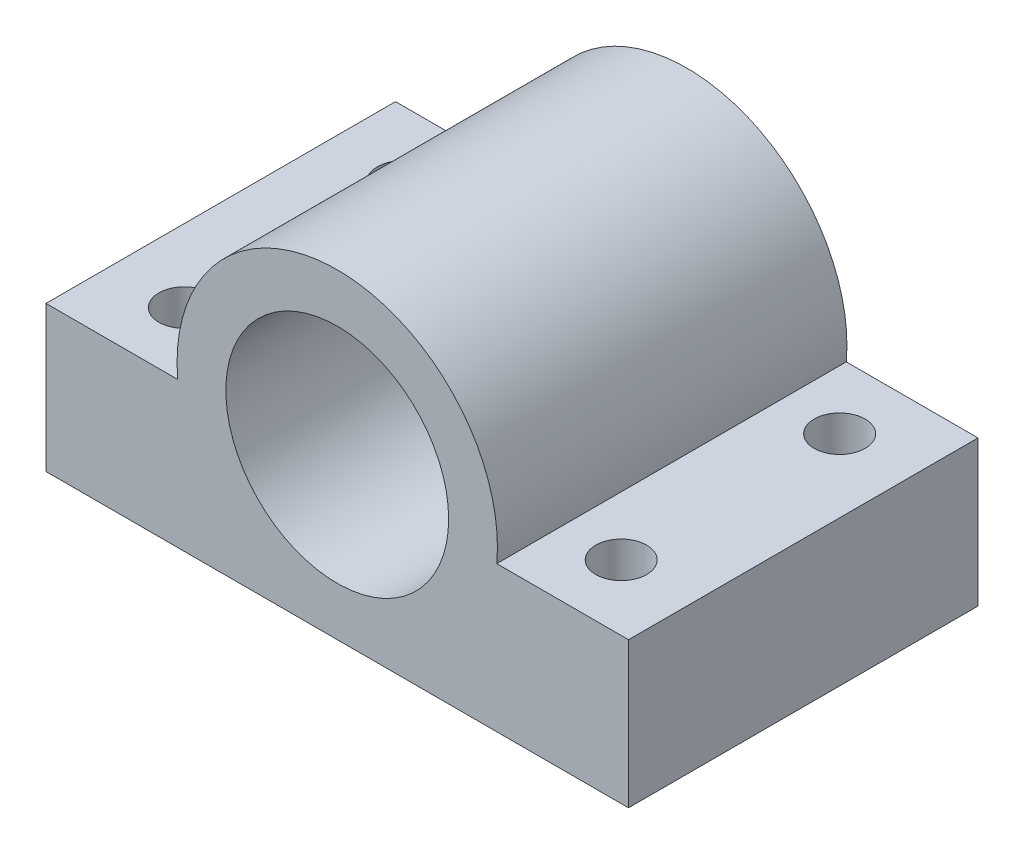
ISO-10303-21;
HEADER;
FILE_DESCRIPTION(('STEP AP214'),'2;1');
FILE_NAME('part.step','',(''),(''),'','','');
FILE_SCHEMA(('AUTOMOTIVE_DESIGN { 1 0 10303 214 1 1 1 1 }'));
ENDSEC;
DATA;
#1=APPLICATION_CONTEXT('core data for automotive mechanical design processes');
#2=APPLICATION_PROTOCOL_DEFINITION('international standard','automotive_design',2000,#1);
#3=PRODUCT_CONTEXT('',#1,'mechanical');
#4=PRODUCT('Part','Part','',(#3));
#5=PRODUCT_RELATED_PRODUCT_CATEGORY('part','',(#4));
#6=PRODUCT_DEFINITION_FORMATION('','',#4);
#7=PRODUCT_DEFINITION_CONTEXT('part definition',#1,'design');
#8=PRODUCT_DEFINITION('design','',#6,#7);
#9=PRODUCT_DEFINITION_SHAPE('','',#8);
#10=(LENGTH_UNIT() NAMED_UNIT(*) SI_UNIT(.MILLI.,.METRE.));
#11=(NAMED_UNIT(*) PLANE_ANGLE_UNIT() SI_UNIT($,.RADIAN.));
#12=(NAMED_UNIT(*) SI_UNIT($,.STERADIAN.) SOLID_ANGLE_UNIT());
#13=UNCERTAINTY_MEASURE_WITH_UNIT(LENGTH_MEASURE(1.E-05),#10,'distance_accuracy_value','');
#14=(GEOMETRIC_REPRESENTATION_CONTEXT(3) GLOBAL_UNCERTAINTY_ASSIGNED_CONTEXT((#13)) GLOBAL_UNIT_ASSIGNED_CONTEXT((#10,
#11,#12)) REPRESENTATION_CONTEXT('',''));
#15=CARTESIAN_POINT('',(0.,0.,0.));
#16=DIRECTION('',(0.,0.,1.));
#17=DIRECTION('',(1.,0.,0.));
#18=AXIS2_PLACEMENT_3D('',#15,#16,#17);
#19=CARTESIAN_POINT('',(0.,0.,24.));
#20=DIRECTION('',(0.,0.,1.));
#21=DIRECTION('',(1.,0.,0.));
#22=AXIS2_PLACEMENT_3D('',#19,#20,#21);
#23=PLANE('',#22);
#24=CARTESIAN_POINT('',(0.,0.,24.));
#25=DIRECTION('',(0.,0.,1.));
#26=DIRECTION('',(1.,0.,0.));
#27=AXIS2_PLACEMENT_3D('',#24,#25,#26);
#28=CIRCLE('',#27,11.);
#29=CARTESIAN_POINT('',(10.9544511501033,-0.999999999999997,24.));
#30=VERTEX_POINT('',#29);
#31=CARTESIAN_POINT('',(-10.9544511501033,-0.999999999999997,24.));
#32=VERTEX_POINT('',#31);
#33=EDGE_CURVE('E142',#30,#32,#28,.T.);
#34=ORIENTED_EDGE('',*,*,#33,.T.);
#35=DIRECTION('',(-1.,0.,0.));
#36=VECTOR('',#35,1.);
#37=CARTESIAN_POINT('',(-10.9544511501033,-0.999999999999997,24.));
#38=LINE('',#37,#36);
#39=CARTESIAN_POINT('',(-20.,-0.999999999999999,24.));
#40=VERTEX_POINT('',#39);
#41=EDGE_CURVE('E100',#32,#40,#38,.T.);
#42=ORIENTED_EDGE('',*,*,#41,.T.);
#43=DIRECTION('',(0.,-1.,0.));
#44=VECTOR('',#43,1.);
#45=CARTESIAN_POINT('',(-20.,-0.999999999999999,24.));
#46=LINE('',#45,#44);
#47=CARTESIAN_POINT('',(-20.,-11.,24.));
#48=VERTEX_POINT('',#47);
#49=EDGE_CURVE('E113',#40,#48,#46,.T.);
#50=ORIENTED_EDGE('',*,*,#49,.T.);
#51=DIRECTION('',(1.,0.,0.));
#52=VECTOR('',#51,1.);
#53=CARTESIAN_POINT('',(-20.,-11.,24.));
#54=LINE('',#53,#52);
#55=CARTESIAN_POINT('',(20.,-11.,24.));
#56=VERTEX_POINT('',#55);
#57=EDGE_CURVE('E107',#48,#56,#54,.T.);
#58=ORIENTED_EDGE('',*,*,#57,.T.);
#59=DIRECTION('',(0.,1.,0.));
#60=VECTOR('',#59,1.);
#61=CARTESIAN_POINT('',(20.,-11.,24.));
#62=LINE('',#61,#60);
#63=CARTESIAN_POINT('',(20.,-0.999999999999999,24.));
#64=VERTEX_POINT('',#63);
#65=EDGE_CURVE('E111',#56,#64,#62,.T.);
#66=ORIENTED_EDGE('',*,*,#65,.T.);
#67=DIRECTION('',(-1.,0.,0.));
#68=VECTOR('',#67,1.);
#69=CARTESIAN_POINT('',(20.,-0.999999999999999,24.));
#70=LINE('',#69,#68);
#71=EDGE_CURVE('E63',#64,#30,#70,.T.);
#72=ORIENTED_EDGE('',*,*,#71,.T.);
#73=EDGE_LOOP('',(#34,#42,#50,#58,#66,#72));
#74=FACE_BOUND('',#73,.T.);
#75=CARTESIAN_POINT('',(0.,0.,24.));
#76=DIRECTION('',(0.,0.,1.));
#77=DIRECTION('',(1.,0.,0.));
#78=AXIS2_PLACEMENT_3D('',#75,#76,#77);
#79=CIRCLE('',#78,7.65);
#80=CARTESIAN_POINT('',(7.65,0.,24.));
#81=VERTEX_POINT('',#80);
#82=EDGE_CURVE('E134',#81,#81,#79,.T.);
#83=ORIENTED_EDGE('',*,*,#82,.F.);
#84=EDGE_LOOP('',(#83));
#85=FACE_BOUND('',#84,.T.);
#86=ADVANCED_FACE('F44',(#74,#85),#23,.T.);
#87=CARTESIAN_POINT('',(0.,0.,0.));
#88=DIRECTION('',(0.,0.,1.));
#89=DIRECTION('',(1.,0.,0.));
#90=AXIS2_PLACEMENT_3D('',#87,#88,#89);
#91=PLANE('',#90);
#92=CARTESIAN_POINT('',(0.,0.,0.));
#93=DIRECTION('',(0.,0.,1.));
#94=DIRECTION('',(1.,0.,0.));
#95=AXIS2_PLACEMENT_3D('',#92,#93,#94);
#96=CIRCLE('',#95,11.);
#97=CARTESIAN_POINT('',(10.9544511501033,-0.999999999999997,0.));
#98=VERTEX_POINT('',#97);
#99=CARTESIAN_POINT('',(-10.9544511501033,-0.999999999999997,0.));
#100=VERTEX_POINT('',#99);
#101=EDGE_CURVE('E130',#98,#100,#96,.T.);
#102=ORIENTED_EDGE('',*,*,#101,.F.);
#103=DIRECTION('',(-1.,0.,0.));
#104=VECTOR('',#103,1.);
#105=CARTESIAN_POINT('',(20.,-0.999999999999999,0.));
#106=LINE('',#105,#104);
#107=CARTESIAN_POINT('',(20.,-0.999999999999999,0.));
#108=VERTEX_POINT('',#107);
#109=EDGE_CURVE('E92',#108,#98,#106,.T.);
#110=ORIENTED_EDGE('',*,*,#109,.F.);
#111=DIRECTION('',(0.,1.,0.));
#112=VECTOR('',#111,1.);
#113=CARTESIAN_POINT('',(20.,-11.,0.));
#114=LINE('',#113,#112);
#115=CARTESIAN_POINT('',(20.,-11.,0.));
#116=VERTEX_POINT('',#115);
#117=EDGE_CURVE('E86',#116,#108,#114,.T.);
#118=ORIENTED_EDGE('',*,*,#117,.F.);
#119=DIRECTION('',(1.,0.,0.));
#120=VECTOR('',#119,1.);
#121=CARTESIAN_POINT('',(0.,-11.,0.));
#122=LINE('',#121,#120);
#123=CARTESIAN_POINT('',(-20.,-11.,0.));
#124=VERTEX_POINT('',#123);
#125=EDGE_CURVE('E120',#124,#116,#122,.T.);
#126=ORIENTED_EDGE('',*,*,#125,.F.);
#127=DIRECTION('',(0.,-1.,0.));
#128=VECTOR('',#127,1.);
#129=CARTESIAN_POINT('',(-20.,-0.999999999999999,0.));
#130=LINE('',#129,#128);
#131=CARTESIAN_POINT('',(-20.,-0.999999999999999,0.));
#132=VERTEX_POINT('',#131);
#133=EDGE_CURVE('E136',#132,#124,#130,.T.);
#134=ORIENTED_EDGE('',*,*,#133,.F.);
#135=DIRECTION('',(-1.,0.,0.));
#136=VECTOR('',#135,1.);
#137=CARTESIAN_POINT('',(-10.9544511501033,-0.999999999999997,0.));
#138=LINE('',#137,#136);
#139=EDGE_CURVE('E133',#100,#132,#138,.T.);
#140=ORIENTED_EDGE('',*,*,#139,.F.);
#141=EDGE_LOOP('',(#102,#110,#118,#126,#134,#140));
#142=FACE_BOUND('',#141,.T.);
#143=CARTESIAN_POINT('',(0.,0.,0.));
#144=DIRECTION('',(0.,0.,1.));
#145=DIRECTION('',(1.,0.,0.));
#146=AXIS2_PLACEMENT_3D('',#143,#144,#145);
#147=CIRCLE('',#146,7.65);
#148=CARTESIAN_POINT('',(7.65,0.,0.));
#149=VERTEX_POINT('',#148);
#150=EDGE_CURVE('E149',#149,#149,#147,.T.);
#151=ORIENTED_EDGE('',*,*,#150,.T.);
#152=EDGE_LOOP('',(#151));
#153=FACE_BOUND('',#152,.T.);
#154=ADVANCED_FACE('F176',(#142,#153),#91,.F.);
#155=CARTESIAN_POINT('',(0.,0.,24.));
#156=DIRECTION('',(0.,0.,-1.));
#157=DIRECTION('',(-1.,0.,0.));
#158=AXIS2_PLACEMENT_3D('',#155,#156,#157);
#159=CYLINDRICAL_SURFACE('',#158,11.);
#160=ORIENTED_EDGE('',*,*,#101,.T.);
#161=DIRECTION('',(0.,0.,-1.));
#162=VECTOR('',#161,1.);
#163=CARTESIAN_POINT('',(-10.9544511501033,-0.999999999999997,24.));
#164=LINE('',#163,#162);
#165=EDGE_CURVE('E13',#32,#100,#164,.T.);
#166=ORIENTED_EDGE('',*,*,#165,.F.);
#167=ORIENTED_EDGE('',*,*,#33,.F.);
#168=DIRECTION('',(0.,0.,-1.));
#169=VECTOR('',#168,1.);
#170=CARTESIAN_POINT('',(10.9544511501033,-0.999999999999997,24.));
#171=LINE('',#170,#169);
#172=EDGE_CURVE('E126',#30,#98,#171,.T.);
#173=ORIENTED_EDGE('',*,*,#172,.T.);
#174=EDGE_LOOP('',(#160,#166,#167,#173));
#175=FACE_BOUND('',#174,.T.);
#176=ADVANCED_FACE('F46',(#175),#159,.T.);
#177=CARTESIAN_POINT('',(-10.9544511501033,-0.999999999999997,24.));
#178=DIRECTION('',(0.,-1.,0.));
#179=DIRECTION('',(1.,0.,0.));
#180=AXIS2_PLACEMENT_3D('',#177,#178,#179);
#181=PLANE('',#180);
#182=CARTESIAN_POINT('',(-15.,-0.999999999999997,4.5));
#183=DIRECTION('',(0.,-1.,0.));
#184=DIRECTION('',(1.,0.,0.));
#185=AXIS2_PLACEMENT_3D('',#182,#183,#184);
#186=CIRCLE('',#185,1.75);
#187=CARTESIAN_POINT('',(-13.25,-0.999999999999997,4.5));
#188=VERTEX_POINT('',#187);
#189=EDGE_CURVE('E156',#188,#188,#186,.T.);
#190=ORIENTED_EDGE('',*,*,#189,.T.);
#191=EDGE_LOOP('',(#190));
#192=FACE_BOUND('',#191,.T.);
#193=CARTESIAN_POINT('',(-15.,-0.999999999999997,19.5));
#194=DIRECTION('',(0.,-1.,0.));
#195=DIRECTION('',(1.,0.,0.));
#196=AXIS2_PLACEMENT_3D('',#193,#194,#195);
#197=CIRCLE('',#196,1.75);
#198=CARTESIAN_POINT('',(-13.25,-0.999999999999997,19.5));
#199=VERTEX_POINT('',#198);
#200=EDGE_CURVE('E161',#199,#199,#197,.T.);
#201=ORIENTED_EDGE('',*,*,#200,.T.);
#202=EDGE_LOOP('',(#201));
#203=FACE_BOUND('',#202,.T.);
#204=ORIENTED_EDGE('',*,*,#139,.T.);
#205=DIRECTION('',(0.,0.,-1.));
#206=VECTOR('',#205,1.);
#207=CARTESIAN_POINT('',(-20.,-0.999999999999999,24.));
#208=LINE('',#207,#206);
#209=EDGE_CURVE('E54',#40,#132,#208,.T.);
#210=ORIENTED_EDGE('',*,*,#209,.F.);
#211=ORIENTED_EDGE('',*,*,#41,.F.);
#212=ORIENTED_EDGE('',*,*,#165,.T.);
#213=EDGE_LOOP('',(#204,#210,#211,#212));
#214=FACE_BOUND('',#213,.T.);
#215=ADVANCED_FACE('F170',(#192,#203,#214),#181,.F.);
#216=CARTESIAN_POINT('',(-20.,-0.999999999999999,24.));
#217=DIRECTION('',(1.,0.,0.));
#218=DIRECTION('',(0.,0.,-1.));
#219=AXIS2_PLACEMENT_3D('',#216,#217,#218);
#220=PLANE('',#219);
#221=ORIENTED_EDGE('',*,*,#133,.T.);
#222=DIRECTION('',(0.,0.,-1.));
#223=VECTOR('',#222,1.);
#224=CARTESIAN_POINT('',(-20.,-11.,24.));
#225=LINE('',#224,#223);
#226=EDGE_CURVE('E121',#48,#124,#225,.T.);
#227=ORIENTED_EDGE('',*,*,#226,.F.);
#228=ORIENTED_EDGE('',*,*,#49,.F.);
#229=ORIENTED_EDGE('',*,*,#209,.T.);
#230=EDGE_LOOP('',(#221,#227,#228,#229));
#231=FACE_BOUND('',#230,.T.);
#232=ADVANCED_FACE('F173',(#231),#220,.F.);
#233=CARTESIAN_POINT('',(0.,-11.,24.));
#234=DIRECTION('',(0.,1.,0.));
#235=DIRECTION('',(0.,0.,1.));
#236=AXIS2_PLACEMENT_3D('',#233,#234,#235);
#237=PLANE('',#236);
#238=CARTESIAN_POINT('',(15.,-11.,4.49999999999999));
#239=DIRECTION('',(0.,-1.,0.));
#240=DIRECTION('',(0.,0.,-1.));
#241=AXIS2_PLACEMENT_3D('',#238,#239,#240);
#242=CIRCLE('',#241,1.75);
#243=CARTESIAN_POINT('',(15.,-11.,2.74999999999999));
#244=VERTEX_POINT('',#243);
#245=EDGE_CURVE('E218',#244,#244,#242,.T.);
#246=ORIENTED_EDGE('',*,*,#245,.F.);
#247=EDGE_LOOP('',(#246));
#248=FACE_BOUND('',#247,.T.);
#249=CARTESIAN_POINT('',(-15.,-11.,4.5));
#250=DIRECTION('',(0.,-1.,0.));
#251=DIRECTION('',(0.,0.,-1.));
#252=AXIS2_PLACEMENT_3D('',#249,#250,#251);
#253=CIRCLE('',#252,1.75);
#254=CARTESIAN_POINT('',(-15.,-11.,2.75));
#255=VERTEX_POINT('',#254);
#256=EDGE_CURVE('E221',#255,#255,#253,.T.);
#257=ORIENTED_EDGE('',*,*,#256,.F.);
#258=EDGE_LOOP('',(#257));
#259=FACE_BOUND('',#258,.T.);
#260=CARTESIAN_POINT('',(-15.,-11.,19.5));
#261=DIRECTION('',(0.,-1.,0.));
#262=DIRECTION('',(0.,0.,-1.));
#263=AXIS2_PLACEMENT_3D('',#260,#261,#262);
#264=CIRCLE('',#263,1.75);
#265=CARTESIAN_POINT('',(-15.,-11.,17.75));
#266=VERTEX_POINT('',#265);
#267=EDGE_CURVE('E224',#266,#266,#264,.T.);
#268=ORIENTED_EDGE('',*,*,#267,.F.);
#269=EDGE_LOOP('',(#268));
#270=FACE_BOUND('',#269,.T.);
#271=CARTESIAN_POINT('',(15.,-11.,19.5));
#272=DIRECTION('',(0.,-1.,0.));
#273=DIRECTION('',(0.,0.,-1.));
#274=AXIS2_PLACEMENT_3D('',#271,#272,#273);
#275=CIRCLE('',#274,1.75);
#276=CARTESIAN_POINT('',(15.,-11.,17.75));
#277=VERTEX_POINT('',#276);
#278=EDGE_CURVE('E150',#277,#277,#275,.T.);
#279=ORIENTED_EDGE('',*,*,#278,.F.);
#280=EDGE_LOOP('',(#279));
#281=FACE_BOUND('',#280,.T.);
#282=ORIENTED_EDGE('',*,*,#125,.T.);
#283=DIRECTION('',(0.,0.,-1.));
#284=VECTOR('',#283,1.);
#285=CARTESIAN_POINT('',(20.,-11.,24.));
#286=LINE('',#285,#284);
#287=EDGE_CURVE('E118',#56,#116,#286,.T.);
#288=ORIENTED_EDGE('',*,*,#287,.F.);
#289=ORIENTED_EDGE('',*,*,#57,.F.);
#290=ORIENTED_EDGE('',*,*,#226,.T.);
#291=EDGE_LOOP('',(#282,#288,#289,#290));
#292=FACE_BOUND('',#291,.T.);
#293=ADVANCED_FACE('F119',(#248,#259,#270,#281,#292),#237,.F.);
#294=CARTESIAN_POINT('',(20.,-11.,24.));
#295=DIRECTION('',(-1.,0.,0.));
#296=DIRECTION('',(0.,0.,1.));
#297=AXIS2_PLACEMENT_3D('',#294,#295,#296);
#298=PLANE('',#297);
#299=ORIENTED_EDGE('',*,*,#117,.T.);
#300=DIRECTION('',(0.,0.,-1.));
#301=VECTOR('',#300,1.);
#302=CARTESIAN_POINT('',(20.,-0.999999999999999,24.));
#303=LINE('',#302,#301);
#304=EDGE_CURVE('E122',#64,#108,#303,.T.);
#305=ORIENTED_EDGE('',*,*,#304,.F.);
#306=ORIENTED_EDGE('',*,*,#65,.F.);
#307=ORIENTED_EDGE('',*,*,#287,.T.);
#308=EDGE_LOOP('',(#299,#305,#306,#307));
#309=FACE_BOUND('',#308,.T.);
#310=ADVANCED_FACE('F124',(#309),#298,.F.);
#311=CARTESIAN_POINT('',(20.,-0.999999999999999,24.));
#312=DIRECTION('',(0.,-1.,0.));
#313=DIRECTION('',(1.,0.,0.));
#314=AXIS2_PLACEMENT_3D('',#311,#312,#313);
#315=PLANE('',#314);
#316=CARTESIAN_POINT('',(15.,-0.999999999999997,4.49999999999999));
#317=DIRECTION('',(0.,-1.,0.));
#318=DIRECTION('',(1.,0.,0.));
#319=AXIS2_PLACEMENT_3D('',#316,#317,#318);
#320=CIRCLE('',#319,1.75);
#321=CARTESIAN_POINT('',(16.75,-0.999999999999998,4.49999999999999));
#322=VERTEX_POINT('',#321);
#323=EDGE_CURVE('E48',#322,#322,#320,.T.);
#324=ORIENTED_EDGE('',*,*,#323,.T.);
#325=EDGE_LOOP('',(#324));
#326=FACE_BOUND('',#325,.T.);
#327=CARTESIAN_POINT('',(15.,-0.999999999999997,19.5));
#328=DIRECTION('',(0.,-1.,0.));
#329=DIRECTION('',(1.,0.,0.));
#330=AXIS2_PLACEMENT_3D('',#327,#328,#329);
#331=CIRCLE('',#330,1.75);
#332=CARTESIAN_POINT('',(16.75,-0.999999999999998,19.5));
#333=VERTEX_POINT('',#332);
#334=EDGE_CURVE('E147',#333,#333,#331,.T.);
#335=ORIENTED_EDGE('',*,*,#334,.T.);
#336=EDGE_LOOP('',(#335));
#337=FACE_BOUND('',#336,.T.);
#338=ORIENTED_EDGE('',*,*,#109,.T.);
#339=ORIENTED_EDGE('',*,*,#172,.F.);
#340=ORIENTED_EDGE('',*,*,#71,.F.);
#341=ORIENTED_EDGE('',*,*,#304,.T.);
#342=EDGE_LOOP('',(#338,#339,#340,#341));
#343=FACE_BOUND('',#342,.T.);
#344=ADVANCED_FACE('F179',(#326,#337,#343),#315,.F.);
#345=CARTESIAN_POINT('',(0.,0.,24.));
#346=DIRECTION('',(0.,0.,-1.));
#347=DIRECTION('',(-1.,0.,0.));
#348=AXIS2_PLACEMENT_3D('',#345,#346,#347);
#349=CYLINDRICAL_SURFACE('',#348,7.65);
#350=ORIENTED_EDGE('',*,*,#82,.T.);
#351=EDGE_LOOP('',(#350));
#352=FACE_BOUND('',#351,.T.);
#353=ORIENTED_EDGE('',*,*,#150,.F.);
#354=EDGE_LOOP('',(#353));
#355=FACE_BOUND('',#354,.T.);
#356=ADVANCED_FACE('F181',(#352,#355),#349,.F.);
#357=CARTESIAN_POINT('',(15.,9.,19.5));
#358=DIRECTION('',(0.,-1.,0.));
#359=DIRECTION('',(0.,0.,-1.));
#360=AXIS2_PLACEMENT_3D('',#357,#358,#359);
#361=CYLINDRICAL_SURFACE('',#360,1.75);
#362=ORIENTED_EDGE('',*,*,#278,.T.);
#363=EDGE_LOOP('',(#362));
#364=FACE_BOUND('',#363,.T.);
#365=ORIENTED_EDGE('',*,*,#334,.F.);
#366=EDGE_LOOP('',(#365));
#367=FACE_BOUND('',#366,.T.);
#368=ADVANCED_FACE('F188',(#364,#367),#361,.F.);
#369=CARTESIAN_POINT('',(15.,9.,4.49999999999999));
#370=DIRECTION('',(0.,-1.,0.));
#371=DIRECTION('',(0.,0.,-1.));
#372=AXIS2_PLACEMENT_3D('',#369,#370,#371);
#373=CYLINDRICAL_SURFACE('',#372,1.75);
#374=ORIENTED_EDGE('',*,*,#245,.T.);
#375=EDGE_LOOP('',(#374));
#376=FACE_BOUND('',#375,.T.);
#377=ORIENTED_EDGE('',*,*,#323,.F.);
#378=EDGE_LOOP('',(#377));
#379=FACE_BOUND('',#378,.T.);
#380=ADVANCED_FACE('F202',(#376,#379),#373,.F.);
#381=CARTESIAN_POINT('',(-15.,9.,19.5));
#382=DIRECTION('',(0.,-1.,0.));
#383=DIRECTION('',(0.,0.,-1.));
#384=AXIS2_PLACEMENT_3D('',#381,#382,#383);
#385=CYLINDRICAL_SURFACE('',#384,1.75);
#386=ORIENTED_EDGE('',*,*,#267,.T.);
#387=EDGE_LOOP('',(#386));
#388=FACE_BOUND('',#387,.T.);
#389=ORIENTED_EDGE('',*,*,#200,.F.);
#390=EDGE_LOOP('',(#389));
#391=FACE_BOUND('',#390,.T.);
#392=ADVANCED_FACE('F203',(#388,#391),#385,.F.);
#393=CARTESIAN_POINT('',(-15.,9.,4.5));
#394=DIRECTION('',(0.,-1.,0.));
#395=DIRECTION('',(0.,0.,-1.));
#396=AXIS2_PLACEMENT_3D('',#393,#394,#395);
#397=CYLINDRICAL_SURFACE('',#396,1.75);
#398=ORIENTED_EDGE('',*,*,#256,.T.);
#399=EDGE_LOOP('',(#398));
#400=FACE_BOUND('',#399,.T.);
#401=ORIENTED_EDGE('',*,*,#189,.F.);
#402=EDGE_LOOP('',(#401));
#403=FACE_BOUND('',#402,.T.);
#404=ADVANCED_FACE('F206',(#400,#403),#397,.F.);
#405=CLOSED_SHELL('',(#86,#154,#176,#215,#232,#293,#310,#344,#356,#368,#380,#392,#404));
#406=MANIFOLD_SOLID_BREP('B2',#405);
#407=ADVANCED_BREP_SHAPE_REPRESENTATION('',(#18,#406),#14);
#408=SHAPE_DEFINITION_REPRESENTATION(#9,#407);
ENDSEC;
END-ISO-10303-21;
